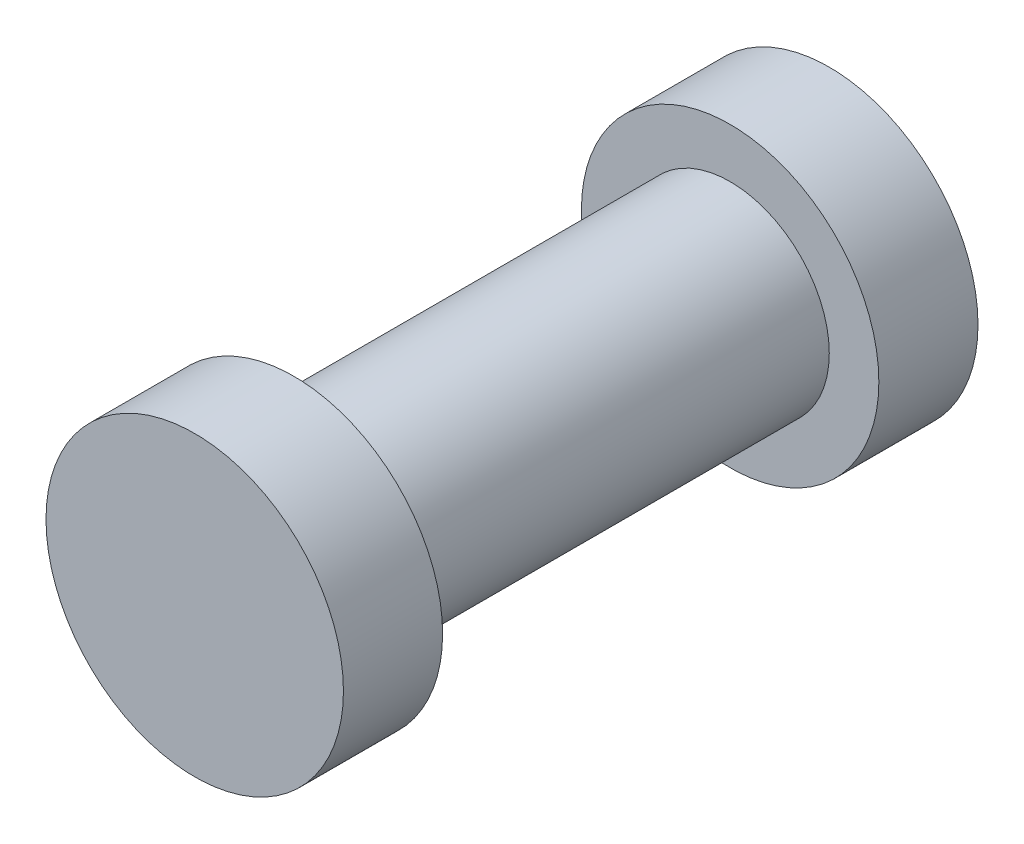
ISO-10303-21;
HEADER;
FILE_DESCRIPTION(('STEP AP214'),'2;1');
FILE_NAME('part.step','',(''),(''),'','','');
FILE_SCHEMA(('AUTOMOTIVE_DESIGN { 1 0 10303 214 1 1 1 1 }'));
ENDSEC;
DATA;
#1=APPLICATION_CONTEXT('core data for automotive mechanical design processes');
#2=APPLICATION_PROTOCOL_DEFINITION('international standard','automotive_design',2000,#1);
#3=PRODUCT_CONTEXT('',#1,'mechanical');
#4=PRODUCT('Part','Part','',(#3));
#5=PRODUCT_RELATED_PRODUCT_CATEGORY('part','',(#4));
#6=PRODUCT_DEFINITION_FORMATION('','',#4);
#7=PRODUCT_DEFINITION_CONTEXT('part definition',#1,'design');
#8=PRODUCT_DEFINITION('design','',#6,#7);
#9=PRODUCT_DEFINITION_SHAPE('','',#8);
#10=(LENGTH_UNIT() NAMED_UNIT(*) SI_UNIT(.MILLI.,.METRE.));
#11=(NAMED_UNIT(*) PLANE_ANGLE_UNIT() SI_UNIT($,.RADIAN.));
#12=(NAMED_UNIT(*) SI_UNIT($,.STERADIAN.) SOLID_ANGLE_UNIT());
#13=UNCERTAINTY_MEASURE_WITH_UNIT(LENGTH_MEASURE(1.E-05),#10,'distance_accuracy_value','');
#14=(GEOMETRIC_REPRESENTATION_CONTEXT(3) GLOBAL_UNCERTAINTY_ASSIGNED_CONTEXT((#13)) GLOBAL_UNIT_ASSIGNED_CONTEXT((#10,
#11,#12)) REPRESENTATION_CONTEXT('',''));
#15=CARTESIAN_POINT('',(0.,0.,0.));
#16=DIRECTION('',(0.,0.,1.));
#17=DIRECTION('',(1.,0.,0.));
#18=AXIS2_PLACEMENT_3D('',#15,#16,#17);
#19=CARTESIAN_POINT('',(0.,0.,32.));
#20=DIRECTION('',(0.,0.,-1.));
#21=DIRECTION('',(-1.,0.,0.));
#22=AXIS2_PLACEMENT_3D('',#19,#20,#21);
#23=CYLINDRICAL_SURFACE('',#22,5.);
#24=CARTESIAN_POINT('',(0.,0.,5.));
#25=DIRECTION('',(0.,0.,1.));
#26=DIRECTION('',(1.,0.,0.));
#27=AXIS2_PLACEMENT_3D('',#24,#25,#26);
#28=CIRCLE('',#27,5.);
#29=CARTESIAN_POINT('',(5.,0.,5.));
#30=VERTEX_POINT('',#29);
#31=EDGE_CURVE('E55',#30,#30,#28,.T.);
#32=ORIENTED_EDGE('',*,*,#31,.T.);
#33=EDGE_LOOP('',(#32));
#34=FACE_BOUND('',#33,.T.);
#35=CARTESIAN_POINT('',(0.,0.,27.));
#36=DIRECTION('',(0.,0.,1.));
#37=DIRECTION('',(1.,0.,0.));
#38=AXIS2_PLACEMENT_3D('',#35,#36,#37);
#39=CIRCLE('',#38,5.);
#40=CARTESIAN_POINT('',(5.,0.,27.));
#41=VERTEX_POINT('',#40);
#42=EDGE_CURVE('E10',#41,#41,#39,.T.);
#43=ORIENTED_EDGE('',*,*,#42,.F.);
#44=EDGE_LOOP('',(#43));
#45=FACE_BOUND('',#44,.T.);
#46=ADVANCED_FACE('F37',(#34,#45),#23,.T.);
#47=CARTESIAN_POINT('',(0.,0.,5.));
#48=DIRECTION('',(0.,0.,1.));
#49=DIRECTION('',(1.,0.,0.));
#50=AXIS2_PLACEMENT_3D('',#47,#48,#49);
#51=PLANE('',#50);
#52=CARTESIAN_POINT('',(0.,0.,5.));
#53=DIRECTION('',(0.,0.,1.));
#54=DIRECTION('',(1.,0.,0.));
#55=AXIS2_PLACEMENT_3D('',#52,#53,#54);
#56=CIRCLE('',#55,7.5);
#57=CARTESIAN_POINT('',(7.5,0.,5.));
#58=VERTEX_POINT('',#57);
#59=EDGE_CURVE('E44',#58,#58,#56,.T.);
#60=ORIENTED_EDGE('',*,*,#59,.T.);
#61=EDGE_LOOP('',(#60));
#62=FACE_BOUND('',#61,.T.);
#63=ORIENTED_EDGE('',*,*,#31,.F.);
#64=EDGE_LOOP('',(#63));
#65=FACE_BOUND('',#64,.T.);
#66=ADVANCED_FACE('F87',(#62,#65),#51,.T.);
#67=CARTESIAN_POINT('',(0.,0.,5.));
#68=DIRECTION('',(0.,0.,-1.));
#69=DIRECTION('',(-1.,0.,0.));
#70=AXIS2_PLACEMENT_3D('',#67,#68,#69);
#71=CYLINDRICAL_SURFACE('',#70,7.5);
#72=ORIENTED_EDGE('',*,*,#59,.F.);
#73=EDGE_LOOP('',(#72));
#74=FACE_BOUND('',#73,.T.);
#75=CARTESIAN_POINT('',(0.,0.,0.));
#76=DIRECTION('',(0.,0.,1.));
#77=DIRECTION('',(1.,0.,0.));
#78=AXIS2_PLACEMENT_3D('',#75,#76,#77);
#79=CIRCLE('',#78,7.5);
#80=CARTESIAN_POINT('',(7.5,0.,0.));
#81=VERTEX_POINT('',#80);
#82=EDGE_CURVE('E49',#81,#81,#79,.T.);
#83=ORIENTED_EDGE('',*,*,#82,.T.);
#84=EDGE_LOOP('',(#83));
#85=FACE_BOUND('',#84,.T.);
#86=ADVANCED_FACE('F84',(#74,#85),#71,.T.);
#87=CARTESIAN_POINT('',(0.,0.,0.));
#88=DIRECTION('',(0.,0.,1.));
#89=DIRECTION('',(1.,0.,0.));
#90=AXIS2_PLACEMENT_3D('',#87,#88,#89);
#91=PLANE('',#90);
#92=ORIENTED_EDGE('',*,*,#82,.F.);
#93=EDGE_LOOP('',(#92));
#94=FACE_BOUND('',#93,.T.);
#95=ADVANCED_FACE('F79',(#94),#91,.F.);
#96=CARTESIAN_POINT('',(0.,0.,27.));
#97=DIRECTION('',(0.,0.,1.));
#98=DIRECTION('',(1.,0.,0.));
#99=AXIS2_PLACEMENT_3D('',#96,#97,#98);
#100=PLANE('',#99);
#101=CARTESIAN_POINT('',(0.,0.,27.));
#102=DIRECTION('',(0.,0.,1.));
#103=DIRECTION('',(1.,0.,0.));
#104=AXIS2_PLACEMENT_3D('',#101,#102,#103);
#105=CIRCLE('',#104,7.5);
#106=CARTESIAN_POINT('',(7.5,0.,27.));
#107=VERTEX_POINT('',#106);
#108=EDGE_CURVE('E61',#107,#107,#105,.T.);
#109=ORIENTED_EDGE('',*,*,#108,.F.);
#110=EDGE_LOOP('',(#109));
#111=FACE_BOUND('',#110,.T.);
#112=ORIENTED_EDGE('',*,*,#42,.T.);
#113=EDGE_LOOP('',(#112));
#114=FACE_BOUND('',#113,.T.);
#115=ADVANCED_FACE('F74',(#111,#114),#100,.F.);
#116=CARTESIAN_POINT('',(0.,0.,32.));
#117=DIRECTION('',(0.,0.,-1.));
#118=DIRECTION('',(-1.,0.,0.));
#119=AXIS2_PLACEMENT_3D('',#116,#117,#118);
#120=CYLINDRICAL_SURFACE('',#119,7.5);
#121=CARTESIAN_POINT('',(0.,0.,32.));
#122=DIRECTION('',(0.,0.,1.));
#123=DIRECTION('',(1.,0.,0.));
#124=AXIS2_PLACEMENT_3D('',#121,#122,#123);
#125=CIRCLE('',#124,7.5);
#126=CARTESIAN_POINT('',(7.5,0.,32.));
#127=VERTEX_POINT('',#126);
#128=EDGE_CURVE('E60',#127,#127,#125,.T.);
#129=ORIENTED_EDGE('',*,*,#128,.F.);
#130=EDGE_LOOP('',(#129));
#131=FACE_BOUND('',#130,.T.);
#132=ORIENTED_EDGE('',*,*,#108,.T.);
#133=EDGE_LOOP('',(#132));
#134=FACE_BOUND('',#133,.T.);
#135=ADVANCED_FACE('F71',(#131,#134),#120,.T.);
#136=CARTESIAN_POINT('',(0.,0.,32.));
#137=DIRECTION('',(0.,0.,1.));
#138=DIRECTION('',(1.,0.,0.));
#139=AXIS2_PLACEMENT_3D('',#136,#137,#138);
#140=PLANE('',#139);
#141=ORIENTED_EDGE('',*,*,#128,.T.);
#142=EDGE_LOOP('',(#141));
#143=FACE_BOUND('',#142,.T.);
#144=ADVANCED_FACE('F69',(#143),#140,.T.);
#145=CLOSED_SHELL('',(#46,#66,#86,#95,#115,#135,#144));
#146=MANIFOLD_SOLID_BREP('B2',#145);
#147=ADVANCED_BREP_SHAPE_REPRESENTATION('',(#18,#146),#14);
#148=SHAPE_DEFINITION_REPRESENTATION(#9,#147);
ENDSEC;
END-ISO-10303-21;
